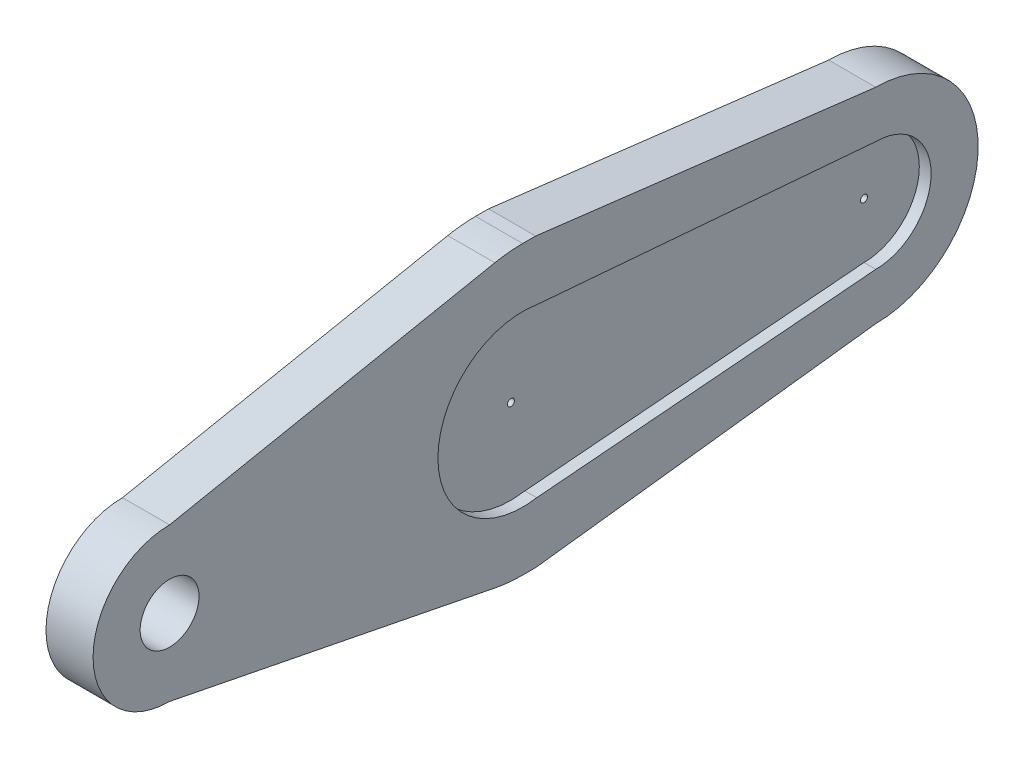
ISO-10303-21;
HEADER;
FILE_DESCRIPTION(('STEP AP214'),'2;1');
FILE_NAME('part.step','',(''),(''),'','','');
FILE_SCHEMA(('AUTOMOTIVE_DESIGN { 1 0 10303 214 1 1 1 1 }'));
ENDSEC;
DATA;
#1=APPLICATION_CONTEXT('core data for automotive mechanical design processes');
#2=APPLICATION_PROTOCOL_DEFINITION('international standard','automotive_design',2000,#1);
#3=PRODUCT_CONTEXT('',#1,'mechanical');
#4=PRODUCT('Part','Part','',(#3));
#5=PRODUCT_RELATED_PRODUCT_CATEGORY('part','',(#4));
#6=PRODUCT_DEFINITION_FORMATION('','',#4);
#7=PRODUCT_DEFINITION_CONTEXT('part definition',#1,'design');
#8=PRODUCT_DEFINITION('design','',#6,#7);
#9=PRODUCT_DEFINITION_SHAPE('','',#8);
#10=(LENGTH_UNIT() NAMED_UNIT(*) SI_UNIT(.MILLI.,.METRE.));
#11=(NAMED_UNIT(*) PLANE_ANGLE_UNIT() SI_UNIT($,.RADIAN.));
#12=(NAMED_UNIT(*) SI_UNIT($,.STERADIAN.) SOLID_ANGLE_UNIT());
#13=UNCERTAINTY_MEASURE_WITH_UNIT(LENGTH_MEASURE(1.E-05),#10,'distance_accuracy_value','');
#14=(GEOMETRIC_REPRESENTATION_CONTEXT(3) GLOBAL_UNCERTAINTY_ASSIGNED_CONTEXT((#13)) GLOBAL_UNIT_ASSIGNED_CONTEXT((#10,
#11,#12)) REPRESENTATION_CONTEXT('',''));
#15=CARTESIAN_POINT('',(0.,0.,0.));
#16=DIRECTION('',(0.,0.,1.));
#17=DIRECTION('',(1.,0.,0.));
#18=AXIS2_PLACEMENT_3D('',#15,#16,#17);
#19=CARTESIAN_POINT('',(2.,0.,0.549999999999999));
#20=DIRECTION('',(-1.,0.,0.));
#21=DIRECTION('',(0.,0.,1.));
#22=AXIS2_PLACEMENT_3D('',#19,#20,#21);
#23=CYLINDRICAL_SURFACE('',#22,3.6);
#24=CARTESIAN_POINT('',(0.,0.,0.549999999999999));
#25=DIRECTION('',(1.,0.,0.));
#26=DIRECTION('',(0.,0.,-1.));
#27=AXIS2_PLACEMENT_3D('',#24,#25,#26);
#28=CIRCLE('',#27,3.6);
#29=CARTESIAN_POINT('',(0.,-3.6,0.549999999999999));
#30=VERTEX_POINT('',#29);
#31=CARTESIAN_POINT('',(0.,-3.55034482758621,-0.0458620689654945));
#32=VERTEX_POINT('',#31);
#33=EDGE_CURVE('E243',#30,#32,#28,.T.);
#34=ORIENTED_EDGE('',*,*,#33,.F.);
#35=DIRECTION('',(-1.,0.,0.));
#36=VECTOR('',#35,1.);
#37=CARTESIAN_POINT('',(1.5,-3.6,0.549999999999999));
#38=LINE('',#37,#36);
#39=CARTESIAN_POINT('',(1.5,-3.6,0.549999999999999));
#40=VERTEX_POINT('',#39);
#41=EDGE_CURVE('E283',#40,#30,#38,.T.);
#42=ORIENTED_EDGE('',*,*,#41,.F.);
#43=CARTESIAN_POINT('',(1.5,0.,0.549999999999999));
#44=DIRECTION('',(1.,0.,0.));
#45=DIRECTION('',(0.,0.,-1.));
#46=AXIS2_PLACEMENT_3D('',#43,#44,#45);
#47=CIRCLE('',#46,3.6);
#48=CARTESIAN_POINT('',(1.5,3.6,0.549999999999999));
#49=VERTEX_POINT('',#48);
#50=EDGE_CURVE('E285',#49,#40,#47,.T.);
#51=ORIENTED_EDGE('',*,*,#50,.F.);
#52=DIRECTION('',(-1.,0.,0.));
#53=VECTOR('',#52,1.);
#54=CARTESIAN_POINT('',(1.5,3.6,0.549999999999999));
#55=LINE('',#54,#53);
#56=CARTESIAN_POINT('',(0.,3.6,0.549999999999999));
#57=VERTEX_POINT('',#56);
#58=EDGE_CURVE('E280',#49,#57,#55,.T.);
#59=ORIENTED_EDGE('',*,*,#58,.T.);
#60=CARTESIAN_POINT('',(0.,3.55034482758621,-0.0458620689654861));
#61=VERTEX_POINT('',#60);
#62=EDGE_CURVE('E240',#61,#57,#28,.T.);
#63=ORIENTED_EDGE('',*,*,#62,.F.);
#64=DIRECTION('',(-1.,0.,0.));
#65=VECTOR('',#64,1.);
#66=CARTESIAN_POINT('',(2.,3.55034482758621,-0.0458620689655113));
#67=LINE('',#66,#65);
#68=CARTESIAN_POINT('',(1.5,3.55034482758621,-0.0458620689654861));
#69=VERTEX_POINT('',#68);
#70=EDGE_CURVE('E277',#61,#69,#67,.F.);
#71=ORIENTED_EDGE('',*,*,#70,.T.);
#72=DIRECTION('',(-1.,0.,0.));
#73=VECTOR('',#72,1.);
#74=CARTESIAN_POINT('',(2.,3.55034482758621,-0.0458620689654861));
#75=LINE('',#74,#73);
#76=CARTESIAN_POINT('',(2.,3.55034482758621,-0.0458620689654861));
#77=VERTEX_POINT('',#76);
#78=EDGE_CURVE('E200',#77,#69,#75,.T.);
#79=ORIENTED_EDGE('',*,*,#78,.F.);
#80=CARTESIAN_POINT('',(2.,0.,0.549999999999999));
#81=DIRECTION('',(1.,0.,0.));
#82=DIRECTION('',(0.,0.,-1.));
#83=AXIS2_PLACEMENT_3D('',#80,#81,#82);
#84=CIRCLE('',#83,3.6);
#85=CARTESIAN_POINT('',(2.,-3.55034482758621,-0.0458620689654945));
#86=VERTEX_POINT('',#85);
#87=EDGE_CURVE('E268',#77,#86,#84,.T.);
#88=ORIENTED_EDGE('',*,*,#87,.T.);
#89=DIRECTION('',(-1.,0.,0.));
#90=VECTOR('',#89,1.);
#91=CARTESIAN_POINT('',(2.,-3.55034482758621,-0.0458620689654945));
#92=LINE('',#91,#90);
#93=CARTESIAN_POINT('',(1.5,-3.55034482758621,-0.0458620689654945));
#94=VERTEX_POINT('',#93);
#95=EDGE_CURVE('E202',#86,#94,#92,.T.);
#96=ORIENTED_EDGE('',*,*,#95,.T.);
#97=DIRECTION('',(-1.,0.,0.));
#98=VECTOR('',#97,1.);
#99=CARTESIAN_POINT('',(2.,-3.55034482758621,-0.0458620689655113));
#100=LINE('',#99,#98);
#101=EDGE_CURVE('E247',#94,#32,#100,.T.);
#102=ORIENTED_EDGE('',*,*,#101,.T.);
#103=EDGE_LOOP('',(#34,#42,#51,#59,#63,#71,#79,#88,#96,#102));
#104=FACE_BOUND('',#103,.T.);
#105=ADVANCED_FACE('F45',(#104),#23,.F.);
#106=CARTESIAN_POINT('',(2.,6.1,0.));
#107=DIRECTION('',(0.,-1.,0.));
#108=DIRECTION('',(0.,0.,-1.));
#109=AXIS2_PLACEMENT_3D('',#106,#107,#108);
#110=PLANE('',#109);
#111=DIRECTION('',(0.,0.,1.));
#112=VECTOR('',#111,1.);
#113=CARTESIAN_POINT('',(0.,6.1,0.));
#114=LINE('',#113,#112);
#115=CARTESIAN_POINT('',(0.,6.1,0.));
#116=VERTEX_POINT('',#115);
#117=CARTESIAN_POINT('',(0.,6.1,0.549999999999999));
#118=VERTEX_POINT('',#117);
#119=EDGE_CURVE('E238',#116,#118,#114,.T.);
#120=ORIENTED_EDGE('',*,*,#119,.T.);
#121=DIRECTION('',(-1.,0.,0.));
#122=VECTOR('',#121,1.);
#123=CARTESIAN_POINT('',(2.,6.1,0.549999999999999));
#124=LINE('',#123,#122);
#125=CARTESIAN_POINT('',(2.,6.1,0.549999999999999));
#126=VERTEX_POINT('',#125);
#127=EDGE_CURVE('E11',#126,#118,#124,.T.);
#128=ORIENTED_EDGE('',*,*,#127,.F.);
#129=DIRECTION('',(0.,0.,1.));
#130=VECTOR('',#129,1.);
#131=CARTESIAN_POINT('',(2.,6.1,0.));
#132=LINE('',#131,#130);
#133=CARTESIAN_POINT('',(2.,6.1,0.));
#134=VERTEX_POINT('',#133);
#135=EDGE_CURVE('E264',#134,#126,#132,.T.);
#136=ORIENTED_EDGE('',*,*,#135,.F.);
#137=DIRECTION('',(-1.,0.,0.));
#138=VECTOR('',#137,1.);
#139=CARTESIAN_POINT('',(2.,6.1,0.));
#140=LINE('',#139,#138);
#141=EDGE_CURVE('E180',#134,#116,#140,.T.);
#142=ORIENTED_EDGE('',*,*,#141,.T.);
#143=EDGE_LOOP('',(#120,#128,#136,#142));
#144=FACE_BOUND('',#143,.T.);
#145=ADVANCED_FACE('F350',(#144),#110,.F.);
#146=CARTESIAN_POINT('',(2.,0.,0.549999999999999));
#147=DIRECTION('',(-1.,0.,0.));
#148=DIRECTION('',(0.,0.,1.));
#149=AXIS2_PLACEMENT_3D('',#146,#147,#148);
#150=CYLINDRICAL_SURFACE('',#149,6.1);
#151=CARTESIAN_POINT('',(0.,0.,0.549999999999999));
#152=DIRECTION('',(1.,0.,0.));
#153=DIRECTION('',(0.,0.,-1.));
#154=AXIS2_PLACEMENT_3D('',#151,#152,#153);
#155=CIRCLE('',#154,6.1);
#156=CARTESIAN_POINT('',(0.,5.98396265759772,1.73414142418716));
#157=VERTEX_POINT('',#156);
#158=EDGE_CURVE('E235',#118,#157,#155,.T.);
#159=ORIENTED_EDGE('',*,*,#158,.T.);
#160=DIRECTION('',(-1.,0.,0.));
#161=VECTOR('',#160,1.);
#162=CARTESIAN_POINT('',(2.,5.98396265759772,1.73414142418716));
#163=LINE('',#162,#161);
#164=CARTESIAN_POINT('',(2.,5.98396265759772,1.73414142418716));
#165=VERTEX_POINT('',#164);
#166=EDGE_CURVE('E54',#165,#157,#163,.T.);
#167=ORIENTED_EDGE('',*,*,#166,.F.);
#168=CARTESIAN_POINT('',(2.,0.,0.549999999999999));
#169=DIRECTION('',(1.,0.,0.));
#170=DIRECTION('',(0.,0.,-1.));
#171=AXIS2_PLACEMENT_3D('',#168,#169,#170);
#172=CIRCLE('',#171,6.1);
#173=EDGE_CURVE('E261',#126,#165,#172,.T.);
#174=ORIENTED_EDGE('',*,*,#173,.F.);
#175=ORIENTED_EDGE('',*,*,#127,.T.);
#176=EDGE_LOOP('',(#159,#167,#174,#175));
#177=FACE_BOUND('',#176,.T.);
#178=ADVANCED_FACE('F352',(#177),#150,.T.);
#179=CARTESIAN_POINT('',(2.,6.08869853330339,1.20486717000446));
#180=DIRECTION('',(0.,-0.980977484852086,-0.194121544948715));
#181=DIRECTION('',(0.,0.194121544948715,-0.980977484852086));
#182=AXIS2_PLACEMENT_3D('',#179,#180,#181);
#183=PLANE('',#182);
#184=DIRECTION('',(0.,-0.194121544948715,0.980977484852086));
#185=VECTOR('',#184,1.);
#186=CARTESIAN_POINT('',(0.,6.08869853330339,1.20486717000446));
#187=LINE('',#186,#185);
#188=CARTESIAN_POINT('',(0.,3.25,15.55));
#189=VERTEX_POINT('',#188);
#190=EDGE_CURVE('E232',#157,#189,#187,.T.);
#191=ORIENTED_EDGE('',*,*,#190,.T.);
#192=DIRECTION('',(-1.,0.,0.));
#193=VECTOR('',#192,1.);
#194=CARTESIAN_POINT('',(2.,3.25,15.55));
#195=LINE('',#194,#193);
#196=CARTESIAN_POINT('',(2.,3.25,15.55));
#197=VERTEX_POINT('',#196);
#198=EDGE_CURVE('E192',#197,#189,#195,.T.);
#199=ORIENTED_EDGE('',*,*,#198,.F.);
#200=DIRECTION('',(0.,-0.194121544948715,0.980977484852086));
#201=VECTOR('',#200,1.);
#202=CARTESIAN_POINT('',(2.,6.08869853330339,1.20486717000446));
#203=LINE('',#202,#201);
#204=EDGE_CURVE('E258',#165,#197,#203,.T.);
#205=ORIENTED_EDGE('',*,*,#204,.F.);
#206=ORIENTED_EDGE('',*,*,#166,.T.);
#207=EDGE_LOOP('',(#191,#199,#205,#206));
#208=FACE_BOUND('',#207,.T.);
#209=ADVANCED_FACE('F357',(#208),#183,.F.);
#210=CARTESIAN_POINT('',(2.,0.,15.55));
#211=DIRECTION('',(-1.,0.,0.));
#212=DIRECTION('',(0.,0.,1.));
#213=AXIS2_PLACEMENT_3D('',#210,#211,#212);
#214=CYLINDRICAL_SURFACE('',#213,3.25);
#215=CARTESIAN_POINT('',(0.,0.,15.55));
#216=DIRECTION('',(1.,0.,0.));
#217=DIRECTION('',(0.,0.,-1.));
#218=AXIS2_PLACEMENT_3D('',#215,#216,#217);
#219=CIRCLE('',#218,3.25);
#220=CARTESIAN_POINT('',(0.,-3.25,15.55));
#221=VERTEX_POINT('',#220);
#222=EDGE_CURVE('E229',#189,#221,#219,.T.);
#223=ORIENTED_EDGE('',*,*,#222,.T.);
#224=DIRECTION('',(-1.,0.,0.));
#225=VECTOR('',#224,1.);
#226=CARTESIAN_POINT('',(2.,-3.25,15.55));
#227=LINE('',#226,#225);
#228=CARTESIAN_POINT('',(2.,-3.25,15.55));
#229=VERTEX_POINT('',#228);
#230=EDGE_CURVE('E189',#229,#221,#227,.T.);
#231=ORIENTED_EDGE('',*,*,#230,.F.);
#232=CARTESIAN_POINT('',(2.,0.,15.55));
#233=DIRECTION('',(1.,0.,0.));
#234=DIRECTION('',(0.,0.,-1.));
#235=AXIS2_PLACEMENT_3D('',#232,#233,#234);
#236=CIRCLE('',#235,3.25);
#237=EDGE_CURVE('E255',#197,#229,#236,.T.);
#238=ORIENTED_EDGE('',*,*,#237,.F.);
#239=ORIENTED_EDGE('',*,*,#198,.T.);
#240=EDGE_LOOP('',(#223,#231,#238,#239));
#241=FACE_BOUND('',#240,.T.);
#242=ADVANCED_FACE('F359',(#241),#214,.T.);
#243=CARTESIAN_POINT('',(2.,-6.08869853330339,1.20486717000446));
#244=DIRECTION('',(0.,0.980977484852086,-0.194121544948715));
#245=DIRECTION('',(0.,0.194121544948715,0.980977484852086));
#246=AXIS2_PLACEMENT_3D('',#243,#244,#245);
#247=PLANE('',#246);
#248=DIRECTION('',(0.,-0.194121544948715,-0.980977484852086));
#249=VECTOR('',#248,1.);
#250=CARTESIAN_POINT('',(0.,-6.08869853330339,1.20486717000446));
#251=LINE('',#250,#249);
#252=CARTESIAN_POINT('',(0.,-5.98396265759773,1.73414142418716));
#253=VERTEX_POINT('',#252);
#254=EDGE_CURVE('E226',#221,#253,#251,.T.);
#255=ORIENTED_EDGE('',*,*,#254,.T.);
#256=DIRECTION('',(-1.,0.,0.));
#257=VECTOR('',#256,1.);
#258=CARTESIAN_POINT('',(2.,-5.98396265759773,1.73414142418716));
#259=LINE('',#258,#257);
#260=CARTESIAN_POINT('',(2.,-5.98396265759773,1.73414142418716));
#261=VERTEX_POINT('',#260);
#262=EDGE_CURVE('E186',#261,#253,#259,.T.);
#263=ORIENTED_EDGE('',*,*,#262,.F.);
#264=DIRECTION('',(0.,-0.194121544948715,-0.980977484852086));
#265=VECTOR('',#264,1.);
#266=CARTESIAN_POINT('',(2.,-6.08869853330339,1.20486717000446));
#267=LINE('',#266,#265);
#268=EDGE_CURVE('E252',#229,#261,#267,.T.);
#269=ORIENTED_EDGE('',*,*,#268,.F.);
#270=ORIENTED_EDGE('',*,*,#230,.T.);
#271=EDGE_LOOP('',(#255,#263,#269,#270));
#272=FACE_BOUND('',#271,.T.);
#273=ADVANCED_FACE('F361',(#272),#247,.F.);
#274=CARTESIAN_POINT('',(2.,0.,0.549999999999999));
#275=DIRECTION('',(-1.,0.,0.));
#276=DIRECTION('',(0.,0.,1.));
#277=AXIS2_PLACEMENT_3D('',#274,#275,#276);
#278=CYLINDRICAL_SURFACE('',#277,6.1);
#279=CARTESIAN_POINT('',(0.,0.,0.549999999999999));
#280=DIRECTION('',(1.,0.,0.));
#281=DIRECTION('',(0.,0.,-1.));
#282=AXIS2_PLACEMENT_3D('',#279,#280,#281);
#283=CIRCLE('',#282,6.1);
#284=CARTESIAN_POINT('',(0.,-6.1,0.549999999999999));
#285=VERTEX_POINT('',#284);
#286=EDGE_CURVE('E223',#253,#285,#283,.T.);
#287=ORIENTED_EDGE('',*,*,#286,.T.);
#288=DIRECTION('',(-1.,0.,0.));
#289=VECTOR('',#288,1.);
#290=CARTESIAN_POINT('',(2.,-6.1,0.549999999999999));
#291=LINE('',#290,#289);
#292=CARTESIAN_POINT('',(2.,-6.1,0.549999999999999));
#293=VERTEX_POINT('',#292);
#294=EDGE_CURVE('E178',#293,#285,#291,.T.);
#295=ORIENTED_EDGE('',*,*,#294,.F.);
#296=CARTESIAN_POINT('',(2.,0.,0.549999999999999));
#297=DIRECTION('',(1.,0.,0.));
#298=DIRECTION('',(0.,0.,-1.));
#299=AXIS2_PLACEMENT_3D('',#296,#297,#298);
#300=CIRCLE('',#299,6.1);
#301=EDGE_CURVE('E250',#261,#293,#300,.T.);
#302=ORIENTED_EDGE('',*,*,#301,.F.);
#303=ORIENTED_EDGE('',*,*,#262,.T.);
#304=EDGE_LOOP('',(#287,#295,#302,#303));
#305=FACE_BOUND('',#304,.T.);
#306=ADVANCED_FACE('F365',(#305),#278,.T.);
#307=CARTESIAN_POINT('',(2.,-6.1,0.));
#308=DIRECTION('',(0.,-1.,0.));
#309=DIRECTION('',(0.,0.,-1.));
#310=AXIS2_PLACEMENT_3D('',#307,#308,#309);
#311=PLANE('',#310);
#312=DIRECTION('',(0.,0.,1.));
#313=VECTOR('',#312,1.);
#314=CARTESIAN_POINT('',(0.,-6.1,0.));
#315=LINE('',#314,#313);
#316=CARTESIAN_POINT('',(0.,-6.1,0.));
#317=VERTEX_POINT('',#316);
#318=EDGE_CURVE('E221',#317,#285,#315,.T.);
#319=ORIENTED_EDGE('',*,*,#318,.F.);
#320=DIRECTION('',(-1.,0.,0.));
#321=VECTOR('',#320,1.);
#322=CARTESIAN_POINT('',(2.,-6.1,0.));
#323=LINE('',#322,#321);
#324=CARTESIAN_POINT('',(2.,-6.1,0.));
#325=VERTEX_POINT('',#324);
#326=EDGE_CURVE('E176',#325,#317,#323,.T.);
#327=ORIENTED_EDGE('',*,*,#326,.F.);
#328=DIRECTION('',(0.,0.,1.));
#329=VECTOR('',#328,1.);
#330=CARTESIAN_POINT('',(2.,-6.1,0.));
#331=LINE('',#330,#329);
#332=EDGE_CURVE('E169',#325,#293,#331,.T.);
#333=ORIENTED_EDGE('',*,*,#332,.T.);
#334=ORIENTED_EDGE('',*,*,#294,.T.);
#335=EDGE_LOOP('',(#319,#327,#333,#334));
#336=FACE_BOUND('',#335,.T.);
#337=ADVANCED_FACE('F368',(#336),#311,.T.);
#338=CARTESIAN_POINT('',(2.,-6.01182474689071,-0.728075661388148));
#339=DIRECTION('',(0.,0.992746211513238,0.12022877994105));
#340=DIRECTION('',(0.,-0.12022877994105,0.992746211513238));
#341=AXIS2_PLACEMENT_3D('',#338,#339,#340);
#342=PLANE('',#341);
#343=DIRECTION('',(0.,0.12022877994105,-0.992746211513238));
#344=VECTOR('',#343,1.);
#345=CARTESIAN_POINT('',(0.,-6.01182474689071,-0.728075661388148));
#346=LINE('',#345,#344);
#347=CARTESIAN_POINT('',(0.,-4.35,-14.45));
#348=VERTEX_POINT('',#347);
#349=EDGE_CURVE('E175',#317,#348,#346,.T.);
#350=ORIENTED_EDGE('',*,*,#349,.T.);
#351=DIRECTION('',(-1.,0.,0.));
#352=VECTOR('',#351,1.);
#353=CARTESIAN_POINT('',(2.,-4.35,-14.45));
#354=LINE('',#353,#352);
#355=CARTESIAN_POINT('',(2.,-4.35,-14.45));
#356=VERTEX_POINT('',#355);
#357=EDGE_CURVE('E161',#356,#348,#354,.T.);
#358=ORIENTED_EDGE('',*,*,#357,.F.);
#359=DIRECTION('',(0.,0.12022877994105,-0.992746211513238));
#360=VECTOR('',#359,1.);
#361=CARTESIAN_POINT('',(2.,-6.01182474689071,-0.728075661388148));
#362=LINE('',#361,#360);
#363=EDGE_CURVE('E164',#325,#356,#362,.T.);
#364=ORIENTED_EDGE('',*,*,#363,.F.);
#365=ORIENTED_EDGE('',*,*,#326,.T.);
#366=EDGE_LOOP('',(#350,#358,#364,#365));
#367=FACE_BOUND('',#366,.T.);
#368=ADVANCED_FACE('F174',(#367),#342,.F.);
#369=CARTESIAN_POINT('',(2.,0.,-14.45));
#370=DIRECTION('',(-1.,0.,0.));
#371=DIRECTION('',(0.,0.,1.));
#372=AXIS2_PLACEMENT_3D('',#369,#370,#371);
#373=CYLINDRICAL_SURFACE('',#372,4.35);
#374=CARTESIAN_POINT('',(0.,0.,-14.45));
#375=DIRECTION('',(1.,0.,0.));
#376=DIRECTION('',(0.,0.,-1.));
#377=AXIS2_PLACEMENT_3D('',#374,#375,#376);
#378=CIRCLE('',#377,4.35);
#379=CARTESIAN_POINT('',(0.,4.35,-14.45));
#380=VERTEX_POINT('',#379);
#381=EDGE_CURVE('E218',#348,#380,#378,.T.);
#382=ORIENTED_EDGE('',*,*,#381,.T.);
#383=DIRECTION('',(-1.,0.,0.));
#384=VECTOR('',#383,1.);
#385=CARTESIAN_POINT('',(2.,4.35,-14.45));
#386=LINE('',#385,#384);
#387=CARTESIAN_POINT('',(2.,4.35,-14.45));
#388=VERTEX_POINT('',#387);
#389=EDGE_CURVE('E163',#388,#380,#386,.T.);
#390=ORIENTED_EDGE('',*,*,#389,.F.);
#391=CARTESIAN_POINT('',(2.,0.,-14.45));
#392=DIRECTION('',(1.,0.,0.));
#393=DIRECTION('',(0.,0.,-1.));
#394=AXIS2_PLACEMENT_3D('',#391,#392,#393);
#395=CIRCLE('',#394,4.35);
#396=EDGE_CURVE('E156',#356,#388,#395,.T.);
#397=ORIENTED_EDGE('',*,*,#396,.F.);
#398=ORIENTED_EDGE('',*,*,#357,.T.);
#399=EDGE_LOOP('',(#382,#390,#397,#398));
#400=FACE_BOUND('',#399,.T.);
#401=ADVANCED_FACE('F159',(#400),#373,.T.);
#402=CARTESIAN_POINT('',(2.,0.,-14.45));
#403=DIRECTION('',(-1.,0.,0.));
#404=DIRECTION('',(0.,0.,1.));
#405=AXIS2_PLACEMENT_3D('',#402,#403,#404);
#406=CYLINDRICAL_SURFACE('',#405,2.35);
#407=CARTESIAN_POINT('',(1.5,0.,-14.45));
#408=DIRECTION('',(1.,0.,0.));
#409=DIRECTION('',(0.,0.,-1.));
#410=AXIS2_PLACEMENT_3D('',#407,#408,#409);
#411=CIRCLE('',#410,2.35);
#412=CARTESIAN_POINT('',(1.5,-2.35,-14.45));
#413=VERTEX_POINT('',#412);
#414=CARTESIAN_POINT('',(1.5,2.35,-14.45));
#415=VERTEX_POINT('',#414);
#416=EDGE_CURVE('E298',#413,#415,#411,.T.);
#417=ORIENTED_EDGE('',*,*,#416,.F.);
#418=DIRECTION('',(-1.,0.,0.));
#419=VECTOR('',#418,1.);
#420=CARTESIAN_POINT('',(2.,-2.35,-14.45));
#421=LINE('',#420,#419);
#422=CARTESIAN_POINT('',(2.,-2.35,-14.45));
#423=VERTEX_POINT('',#422);
#424=EDGE_CURVE('E49',#423,#413,#421,.T.);
#425=ORIENTED_EDGE('',*,*,#424,.F.);
#426=CARTESIAN_POINT('',(2.,0.,-14.45));
#427=DIRECTION('',(1.,0.,0.));
#428=DIRECTION('',(0.,0.,-1.));
#429=AXIS2_PLACEMENT_3D('',#426,#427,#428);
#430=CIRCLE('',#429,2.35);
#431=CARTESIAN_POINT('',(2.,2.35,-14.45));
#432=VERTEX_POINT('',#431);
#433=EDGE_CURVE('E271',#423,#432,#430,.T.);
#434=ORIENTED_EDGE('',*,*,#433,.T.);
#435=DIRECTION('',(-1.,0.,0.));
#436=VECTOR('',#435,1.);
#437=CARTESIAN_POINT('',(2.,2.35,-14.45));
#438=LINE('',#437,#436);
#439=EDGE_CURVE('E197',#432,#415,#438,.T.);
#440=ORIENTED_EDGE('',*,*,#439,.T.);
#441=EDGE_LOOP('',(#417,#425,#434,#440));
#442=FACE_BOUND('',#441,.T.);
#443=ADVANCED_FACE('F387',(#442),#406,.F.);
#444=CARTESIAN_POINT('',(2.,-3.52965517241379,-0.294137931034483));
#445=DIRECTION('',(0.,0.99654575824488,0.0830454798537399));
#446=DIRECTION('',(0.,-0.08304547985374,0.99654575824488));
#447=AXIS2_PLACEMENT_3D('',#444,#445,#446);
#448=PLANE('',#447);
#449=DIRECTION('',(0.,0.08304547985374,-0.99654575824488));
#450=VECTOR('',#449,1.);
#451=CARTESIAN_POINT('',(1.5,-3.52965517241379,-0.294137931034483));
#452=LINE('',#451,#450);
#453=EDGE_CURVE('E289',#94,#413,#452,.T.);
#454=ORIENTED_EDGE('',*,*,#453,.F.);
#455=ORIENTED_EDGE('',*,*,#95,.F.);
#456=DIRECTION('',(0.,0.08304547985374,-0.99654575824488));
#457=VECTOR('',#456,1.);
#458=CARTESIAN_POINT('',(2.,-3.52965517241379,-0.294137931034483));
#459=LINE('',#458,#457);
#460=EDGE_CURVE('E120',#86,#423,#459,.T.);
#461=ORIENTED_EDGE('',*,*,#460,.T.);
#462=ORIENTED_EDGE('',*,*,#424,.T.);
#463=EDGE_LOOP('',(#454,#455,#461,#462));
#464=FACE_BOUND('',#463,.T.);
#465=ADVANCED_FACE('F342',(#464),#448,.T.);
#466=CARTESIAN_POINT('',(2.,3.52965517241379,-0.294137931034483));
#467=DIRECTION('',(0.,-0.99654575824488,0.0830454798537399));
#468=DIRECTION('',(0.,-0.08304547985374,-0.99654575824488));
#469=AXIS2_PLACEMENT_3D('',#466,#467,#468);
#470=PLANE('',#469);
#471=DIRECTION('',(0.,0.08304547985374,0.99654575824488));
#472=VECTOR('',#471,1.);
#473=CARTESIAN_POINT('',(1.5,3.52965517241379,-0.294137931034483));
#474=LINE('',#473,#472);
#475=EDGE_CURVE('E294',#415,#69,#474,.T.);
#476=ORIENTED_EDGE('',*,*,#475,.F.);
#477=ORIENTED_EDGE('',*,*,#439,.F.);
#478=DIRECTION('',(0.,0.08304547985374,0.99654575824488));
#479=VECTOR('',#478,1.);
#480=CARTESIAN_POINT('',(2.,3.52965517241379,-0.294137931034483));
#481=LINE('',#480,#479);
#482=EDGE_CURVE('E266',#432,#77,#481,.T.);
#483=ORIENTED_EDGE('',*,*,#482,.T.);
#484=ORIENTED_EDGE('',*,*,#78,.T.);
#485=EDGE_LOOP('',(#476,#477,#483,#484));
#486=FACE_BOUND('',#485,.T.);
#487=ADVANCED_FACE('F385',(#486),#470,.T.);
#488=CARTESIAN_POINT('',(2.,0.,15.55));
#489=DIRECTION('',(-1.,0.,0.));
#490=DIRECTION('',(0.,0.,1.));
#491=AXIS2_PLACEMENT_3D('',#488,#489,#490);
#492=CYLINDRICAL_SURFACE('',#491,1.25);
#493=CARTESIAN_POINT('',(2.,0.,15.55));
#494=DIRECTION('',(1.,0.,0.));
#495=DIRECTION('',(0.,0.,-1.));
#496=AXIS2_PLACEMENT_3D('',#493,#494,#495);
#497=CIRCLE('',#496,1.25);
#498=CARTESIAN_POINT('',(2.,0.,14.3));
#499=VERTEX_POINT('',#498);
#500=EDGE_CURVE('E217',#499,#499,#497,.T.);
#501=ORIENTED_EDGE('',*,*,#500,.T.);
#502=EDGE_LOOP('',(#501));
#503=FACE_BOUND('',#502,.T.);
#504=CARTESIAN_POINT('',(0.,0.,15.55));
#505=DIRECTION('',(1.,0.,0.));
#506=DIRECTION('',(0.,0.,-1.));
#507=AXIS2_PLACEMENT_3D('',#504,#505,#506);
#508=CIRCLE('',#507,1.25);
#509=CARTESIAN_POINT('',(0.,0.,14.3));
#510=VERTEX_POINT('',#509);
#511=EDGE_CURVE('E244',#510,#510,#508,.T.);
#512=ORIENTED_EDGE('',*,*,#511,.F.);
#513=EDGE_LOOP('',(#512));
#514=FACE_BOUND('',#513,.T.);
#515=ADVANCED_FACE('F47',(#503,#514),#492,.F.);
#516=CARTESIAN_POINT('',(2.,6.01182474689071,-0.728075661388148));
#517=DIRECTION('',(0.,-0.992746211513238,0.12022877994105));
#518=DIRECTION('',(0.,-0.12022877994105,-0.992746211513238));
#519=AXIS2_PLACEMENT_3D('',#516,#517,#518);
#520=PLANE('',#519);
#521=DIRECTION('',(0.,0.12022877994105,0.992746211513238));
#522=VECTOR('',#521,1.);
#523=CARTESIAN_POINT('',(0.,6.01182474689071,-0.728075661388148));
#524=LINE('',#523,#522);
#525=EDGE_CURVE('E111',#380,#116,#524,.T.);
#526=ORIENTED_EDGE('',*,*,#525,.T.);
#527=ORIENTED_EDGE('',*,*,#141,.F.);
#528=DIRECTION('',(0.,0.12022877994105,0.992746211513238));
#529=VECTOR('',#528,1.);
#530=CARTESIAN_POINT('',(2.,6.01182474689071,-0.728075661388148));
#531=LINE('',#530,#529);
#532=EDGE_CURVE('E70',#388,#134,#531,.T.);
#533=ORIENTED_EDGE('',*,*,#532,.F.);
#534=ORIENTED_EDGE('',*,*,#389,.T.);
#535=EDGE_LOOP('',(#526,#527,#533,#534));
#536=FACE_BOUND('',#535,.T.);
#537=ADVANCED_FACE('F417',(#536),#520,.F.);
#538=CARTESIAN_POINT('',(2.,0.,0.));
#539=DIRECTION('',(1.,0.,0.));
#540=DIRECTION('',(0.,0.,-1.));
#541=AXIS2_PLACEMENT_3D('',#538,#539,#540);
#542=PLANE('',#541);
#543=ORIENTED_EDGE('',*,*,#500,.F.);
#544=EDGE_LOOP('',(#543));
#545=FACE_BOUND('',#544,.T.);
#546=ORIENTED_EDGE('',*,*,#433,.F.);
#547=ORIENTED_EDGE('',*,*,#460,.F.);
#548=ORIENTED_EDGE('',*,*,#87,.F.);
#549=ORIENTED_EDGE('',*,*,#482,.F.);
#550=EDGE_LOOP('',(#546,#547,#548,#549));
#551=FACE_BOUND('',#550,.T.);
#552=ORIENTED_EDGE('',*,*,#135,.T.);
#553=ORIENTED_EDGE('',*,*,#173,.T.);
#554=ORIENTED_EDGE('',*,*,#204,.T.);
#555=ORIENTED_EDGE('',*,*,#237,.T.);
#556=ORIENTED_EDGE('',*,*,#268,.T.);
#557=ORIENTED_EDGE('',*,*,#301,.T.);
#558=ORIENTED_EDGE('',*,*,#332,.F.);
#559=ORIENTED_EDGE('',*,*,#363,.T.);
#560=ORIENTED_EDGE('',*,*,#396,.T.);
#561=ORIENTED_EDGE('',*,*,#532,.T.);
#562=EDGE_LOOP('',(#552,#553,#554,#555,#556,#557,#558,#559,#560,#561));
#563=FACE_BOUND('',#562,.T.);
#564=ADVANCED_FACE('F167',(#545,#551,#563),#542,.T.);
#565=CARTESIAN_POINT('',(0.,0.,0.));
#566=DIRECTION('',(1.,0.,0.));
#567=DIRECTION('',(0.,0.,-1.));
#568=AXIS2_PLACEMENT_3D('',#565,#566,#567);
#569=PLANE('',#568);
#570=CARTESIAN_POINT('',(0.,0.,0.549999999999999));
#571=DIRECTION('',(1.,0.,0.));
#572=DIRECTION('',(0.,0.,-1.));
#573=AXIS2_PLACEMENT_3D('',#570,#571,#572);
#574=CIRCLE('',#573,0.15);
#575=CARTESIAN_POINT('',(0.,0.,0.4));
#576=VERTEX_POINT('',#575);
#577=EDGE_CURVE('E291',#576,#576,#574,.T.);
#578=ORIENTED_EDGE('',*,*,#577,.T.);
#579=EDGE_LOOP('',(#578));
#580=FACE_BOUND('',#579,.T.);
#581=CARTESIAN_POINT('',(0.,0.,-14.45));
#582=DIRECTION('',(1.,0.,0.));
#583=DIRECTION('',(0.,0.,-1.));
#584=AXIS2_PLACEMENT_3D('',#581,#582,#583);
#585=CIRCLE('',#584,0.150000000000001);
#586=CARTESIAN_POINT('',(0.,0.,-14.6));
#587=VERTEX_POINT('',#586);
#588=EDGE_CURVE('E304',#587,#587,#585,.T.);
#589=ORIENTED_EDGE('',*,*,#588,.T.);
#590=EDGE_LOOP('',(#589));
#591=FACE_BOUND('',#590,.T.);
#592=DIRECTION('',(0.,0.08304547985374,0.99654575824488));
#593=VECTOR('',#592,1.);
#594=CARTESIAN_POINT('',(0.,3.52965517241379,-0.294137931034483));
#595=LINE('',#594,#593);
#596=EDGE_CURVE('E286',#61,#57,#595,.T.);
#597=ORIENTED_EDGE('',*,*,#596,.F.);
#598=ORIENTED_EDGE('',*,*,#62,.T.);
#599=EDGE_LOOP('',(#597,#598));
#600=FACE_BOUND('',#599,.T.);
#601=ORIENTED_EDGE('',*,*,#511,.T.);
#602=EDGE_LOOP('',(#601));
#603=FACE_BOUND('',#602,.T.);
#604=ORIENTED_EDGE('',*,*,#33,.T.);
#605=DIRECTION('',(0.,0.08304547985374,-0.99654575824488));
#606=VECTOR('',#605,1.);
#607=CARTESIAN_POINT('',(0.,-3.52965517241379,-0.294137931034483));
#608=LINE('',#607,#606);
#609=EDGE_CURVE('E61',#30,#32,#608,.T.);
#610=ORIENTED_EDGE('',*,*,#609,.F.);
#611=EDGE_LOOP('',(#604,#610));
#612=FACE_BOUND('',#611,.T.);
#613=ORIENTED_EDGE('',*,*,#119,.F.);
#614=ORIENTED_EDGE('',*,*,#525,.F.);
#615=ORIENTED_EDGE('',*,*,#381,.F.);
#616=ORIENTED_EDGE('',*,*,#349,.F.);
#617=ORIENTED_EDGE('',*,*,#318,.T.);
#618=ORIENTED_EDGE('',*,*,#286,.F.);
#619=ORIENTED_EDGE('',*,*,#254,.F.);
#620=ORIENTED_EDGE('',*,*,#222,.F.);
#621=ORIENTED_EDGE('',*,*,#190,.F.);
#622=ORIENTED_EDGE('',*,*,#158,.F.);
#623=EDGE_LOOP('',(#613,#614,#615,#616,#617,#618,#619,#620,#621,#622));
#624=FACE_BOUND('',#623,.T.);
#625=ADVANCED_FACE('F316',(#580,#591,#600,#603,#612,#624),#569,.F.);
#626=CARTESIAN_POINT('',(1.5,-3.52965517241379,-0.294137931034483));
#627=DIRECTION('',(0.,0.996545758244879,0.08304547985374));
#628=DIRECTION('',(0.,-0.08304547985374,0.99654575824488));
#629=AXIS2_PLACEMENT_3D('',#626,#627,#628);
#630=PLANE('',#629);
#631=ORIENTED_EDGE('',*,*,#101,.F.);
#632=EDGE_CURVE('E301',#40,#94,#452,.T.);
#633=ORIENTED_EDGE('',*,*,#632,.F.);
#634=ORIENTED_EDGE('',*,*,#41,.T.);
#635=ORIENTED_EDGE('',*,*,#609,.T.);
#636=EDGE_LOOP('',(#631,#633,#634,#635));
#637=FACE_BOUND('',#636,.T.);
#638=ADVANCED_FACE('F343',(#637),#630,.F.);
#639=CARTESIAN_POINT('',(1.5,3.52965517241379,-0.294137931034483));
#640=DIRECTION('',(0.,-0.996545758244879,0.08304547985374));
#641=DIRECTION('',(0.,-0.08304547985374,-0.99654575824488));
#642=AXIS2_PLACEMENT_3D('',#639,#640,#641);
#643=PLANE('',#642);
#644=ORIENTED_EDGE('',*,*,#70,.F.);
#645=ORIENTED_EDGE('',*,*,#596,.T.);
#646=ORIENTED_EDGE('',*,*,#58,.F.);
#647=EDGE_CURVE('E297',#69,#49,#474,.T.);
#648=ORIENTED_EDGE('',*,*,#647,.F.);
#649=EDGE_LOOP('',(#644,#645,#646,#648));
#650=FACE_BOUND('',#649,.T.);
#651=ADVANCED_FACE('F329',(#650),#643,.F.);
#652=CARTESIAN_POINT('',(1.5,0.,0.));
#653=DIRECTION('',(1.,0.,0.));
#654=DIRECTION('',(0.,0.,-1.));
#655=AXIS2_PLACEMENT_3D('',#652,#653,#654);
#656=PLANE('',#655);
#657=CARTESIAN_POINT('',(1.5,0.,0.549999999999999));
#658=DIRECTION('',(1.,0.,0.));
#659=DIRECTION('',(0.,0.,-1.));
#660=AXIS2_PLACEMENT_3D('',#657,#658,#659);
#661=CIRCLE('',#660,0.15);
#662=CARTESIAN_POINT('',(1.5,0.,0.4));
#663=VERTEX_POINT('',#662);
#664=EDGE_CURVE('E310',#663,#663,#661,.T.);
#665=ORIENTED_EDGE('',*,*,#664,.F.);
#666=EDGE_LOOP('',(#665));
#667=FACE_BOUND('',#666,.T.);
#668=CARTESIAN_POINT('',(1.5,0.,-14.45));
#669=DIRECTION('',(1.,0.,0.));
#670=DIRECTION('',(0.,0.,-1.));
#671=AXIS2_PLACEMENT_3D('',#668,#669,#670);
#672=CIRCLE('',#671,0.150000000000001);
#673=CARTESIAN_POINT('',(1.5,0.,-14.6));
#674=VERTEX_POINT('',#673);
#675=EDGE_CURVE('E307',#674,#674,#672,.T.);
#676=ORIENTED_EDGE('',*,*,#675,.F.);
#677=EDGE_LOOP('',(#676));
#678=FACE_BOUND('',#677,.T.);
#679=ORIENTED_EDGE('',*,*,#632,.T.);
#680=ORIENTED_EDGE('',*,*,#453,.T.);
#681=ORIENTED_EDGE('',*,*,#416,.T.);
#682=ORIENTED_EDGE('',*,*,#475,.T.);
#683=ORIENTED_EDGE('',*,*,#647,.T.);
#684=ORIENTED_EDGE('',*,*,#50,.T.);
#685=EDGE_LOOP('',(#679,#680,#681,#682,#683,#684));
#686=FACE_BOUND('',#685,.T.);
#687=ADVANCED_FACE('F326',(#667,#678,#686),#656,.T.);
#688=CARTESIAN_POINT('',(0.,0.,-14.45));
#689=DIRECTION('',(1.,0.,0.));
#690=DIRECTION('',(0.,0.,-1.));
#691=AXIS2_PLACEMENT_3D('',#688,#689,#690);
#692=CYLINDRICAL_SURFACE('',#691,0.150000000000001);
#693=ORIENTED_EDGE('',*,*,#588,.F.);
#694=EDGE_LOOP('',(#693));
#695=FACE_BOUND('',#694,.T.);
#696=ORIENTED_EDGE('',*,*,#675,.T.);
#697=EDGE_LOOP('',(#696));
#698=FACE_BOUND('',#697,.T.);
#699=ADVANCED_FACE('F322',(#695,#698),#692,.F.);
#700=CARTESIAN_POINT('',(0.,0.,0.549999999999999));
#701=DIRECTION('',(1.,0.,0.));
#702=DIRECTION('',(0.,0.,-1.));
#703=AXIS2_PLACEMENT_3D('',#700,#701,#702);
#704=CYLINDRICAL_SURFACE('',#703,0.15);
#705=ORIENTED_EDGE('',*,*,#577,.F.);
#706=EDGE_LOOP('',(#705));
#707=FACE_BOUND('',#706,.T.);
#708=ORIENTED_EDGE('',*,*,#664,.T.);
#709=EDGE_LOOP('',(#708));
#710=FACE_BOUND('',#709,.T.);
#711=ADVANCED_FACE('F319',(#707,#710),#704,.F.);
#712=CLOSED_SHELL('',(#105,#145,#178,#209,#242,#273,#306,#337,#368,#401,#443,#465,#487,#515,
#537,#564,#625,#638,#651,#687,#699,#711));
#713=MANIFOLD_SOLID_BREP('B2',#712);
#714=ADVANCED_BREP_SHAPE_REPRESENTATION('',(#18,#713),#14);
#715=SHAPE_DEFINITION_REPRESENTATION(#9,#714);
ENDSEC;
END-ISO-10303-21;
